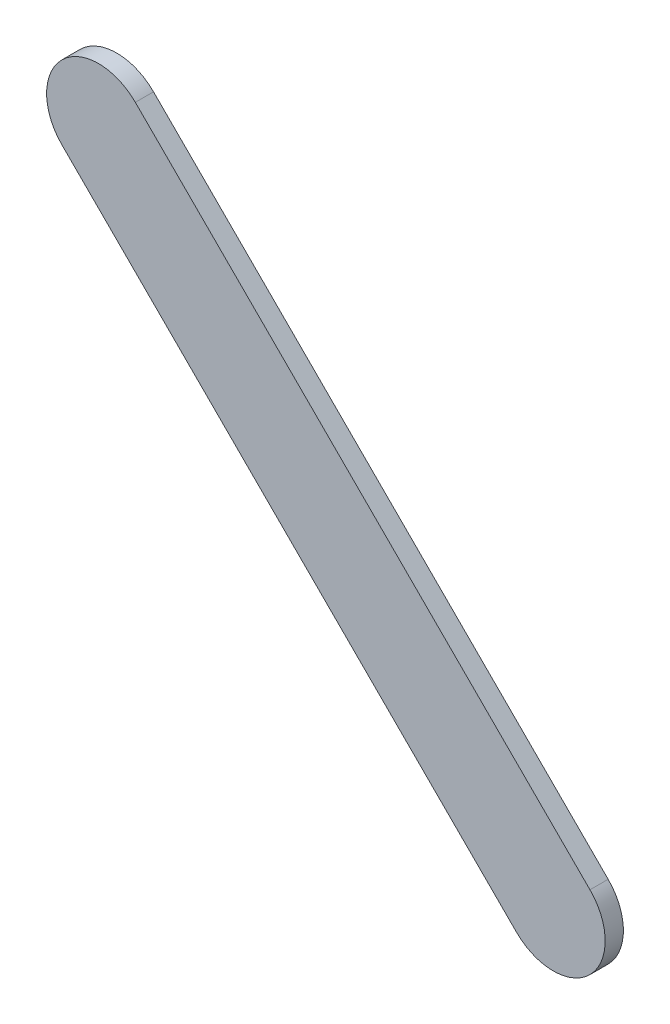
ISO-10303-21;
HEADER;
FILE_DESCRIPTION(('STEP AP214'),'2;1');
FILE_NAME('part.step','',(''),(''),'','','');
FILE_SCHEMA(('AUTOMOTIVE_DESIGN { 1 0 10303 214 1 1 1 1 }'));
ENDSEC;
DATA;
#1=APPLICATION_CONTEXT('core data for automotive mechanical design processes');
#2=APPLICATION_PROTOCOL_DEFINITION('international standard','automotive_design',2000,#1);
#3=PRODUCT_CONTEXT('',#1,'mechanical');
#4=PRODUCT('Part','Part','',(#3));
#5=PRODUCT_RELATED_PRODUCT_CATEGORY('part','',(#4));
#6=PRODUCT_DEFINITION_FORMATION('','',#4);
#7=PRODUCT_DEFINITION_CONTEXT('part definition',#1,'design');
#8=PRODUCT_DEFINITION('design','',#6,#7);
#9=PRODUCT_DEFINITION_SHAPE('','',#8);
#10=(LENGTH_UNIT() NAMED_UNIT(*) SI_UNIT(.MILLI.,.METRE.));
#11=(NAMED_UNIT(*) PLANE_ANGLE_UNIT() SI_UNIT($,.RADIAN.));
#12=(NAMED_UNIT(*) SI_UNIT($,.STERADIAN.) SOLID_ANGLE_UNIT());
#13=UNCERTAINTY_MEASURE_WITH_UNIT(LENGTH_MEASURE(1.E-05),#10,'distance_accuracy_value','');
#14=(GEOMETRIC_REPRESENTATION_CONTEXT(3) GLOBAL_UNCERTAINTY_ASSIGNED_CONTEXT((#13)) GLOBAL_UNIT_ASSIGNED_CONTEXT((#10,
#11,#12)) REPRESENTATION_CONTEXT('',''));
#15=CARTESIAN_POINT('',(0.,0.,0.));
#16=DIRECTION('',(0.,0.,1.));
#17=DIRECTION('',(1.,0.,0.));
#18=AXIS2_PLACEMENT_3D('',#15,#16,#17);
#19=CARTESIAN_POINT('',(86.760096,-111.704289,1.635));
#20=DIRECTION('',(0.,0.,1.));
#21=DIRECTION('',(1.,0.,0.));
#22=AXIS2_PLACEMENT_3D('',#19,#20,#21);
#23=PLANE('',#22);
#24=DIRECTION('',(-0.707106781186548,0.707106781186548,0.));
#25=VECTOR('',#24,1.);
#26=CARTESIAN_POINT('',(86.760096,-111.704289,1.635));
#27=LINE('',#26,#25);
#28=CARTESIAN_POINT('',(86.760096,-111.704289,1.635));
#29=VERTEX_POINT('',#28);
#30=CARTESIAN_POINT('',(85.885096,-110.829289,1.635));
#31=VERTEX_POINT('',#30);
#32=EDGE_CURVE('E93',#29,#31,#27,.T.);
#33=ORIENTED_EDGE('',*,*,#32,.T.);
#34=CARTESIAN_POINT('',(85.8143855,-110.8999995,1.635));
#35=DIRECTION('',(0.,0.,1.));
#36=DIRECTION('',(0.707106781186548,0.707106781186548,0.));
#37=AXIS2_PLACEMENT_3D('',#34,#35,#36);
#38=CIRCLE('',#37,0.09999974810219);
#39=CARTESIAN_POINT('',(85.743675,-110.97071,1.635));
#40=VERTEX_POINT('',#39);
#41=EDGE_CURVE('E74',#31,#40,#38,.T.);
#42=ORIENTED_EDGE('',*,*,#41,.T.);
#43=DIRECTION('',(0.707106781186548,-0.707106781186548,0.));
#44=VECTOR('',#43,1.);
#45=CARTESIAN_POINT('',(85.743675,-110.97071,1.635));
#46=LINE('',#45,#44);
#47=CARTESIAN_POINT('',(86.618675,-111.84571,1.635));
#48=VERTEX_POINT('',#47);
#49=EDGE_CURVE('E87',#40,#48,#46,.T.);
#50=ORIENTED_EDGE('',*,*,#49,.T.);
#51=CARTESIAN_POINT('',(86.6893855,-111.7749995,1.635));
#52=DIRECTION('',(0.,0.,1.));
#53=DIRECTION('',(-0.707106781187048,-0.707106781186048,0.));
#54=AXIS2_PLACEMENT_3D('',#51,#52,#53);
#55=CIRCLE('',#54,0.09999974810218);
#56=EDGE_CURVE('E11',#48,#29,#55,.T.);
#57=ORIENTED_EDGE('',*,*,#56,.T.);
#58=EDGE_LOOP('',(#33,#42,#50,#57));
#59=FACE_BOUND('',#58,.T.);
#60=ADVANCED_FACE('F17',(#59),#23,.T.);
#61=CARTESIAN_POINT('',(86.760096,-111.704289,1.6));
#62=DIRECTION('',(0.,0.,1.));
#63=DIRECTION('',(1.,0.,0.));
#64=AXIS2_PLACEMENT_3D('',#61,#62,#63);
#65=PLANE('',#64);
#66=CARTESIAN_POINT('',(86.6893855,-111.7749995,1.6));
#67=DIRECTION('',(0.,0.,1.));
#68=DIRECTION('',(-0.707106781187048,-0.707106781186048,0.));
#69=AXIS2_PLACEMENT_3D('',#66,#67,#68);
#70=CIRCLE('',#69,0.09999974810218);
#71=CARTESIAN_POINT('',(86.618675,-111.84571,1.6));
#72=VERTEX_POINT('',#71);
#73=CARTESIAN_POINT('',(86.760096,-111.704289,1.6));
#74=VERTEX_POINT('',#73);
#75=EDGE_CURVE('E21',#72,#74,#70,.T.);
#76=ORIENTED_EDGE('',*,*,#75,.F.);
#77=DIRECTION('',(0.707106781186548,-0.707106781186548,0.));
#78=VECTOR('',#77,1.);
#79=CARTESIAN_POINT('',(85.743675,-110.97071,1.6));
#80=LINE('',#79,#78);
#81=CARTESIAN_POINT('',(85.743675,-110.97071,1.6));
#82=VERTEX_POINT('',#81);
#83=EDGE_CURVE('E58',#82,#72,#80,.T.);
#84=ORIENTED_EDGE('',*,*,#83,.F.);
#85=CARTESIAN_POINT('',(85.8143855,-110.8999995,1.6));
#86=DIRECTION('',(0.,0.,1.));
#87=DIRECTION('',(0.707106781186548,0.707106781186548,0.));
#88=AXIS2_PLACEMENT_3D('',#85,#86,#87);
#89=CIRCLE('',#88,0.09999974810219);
#90=CARTESIAN_POINT('',(85.885096,-110.829289,1.6));
#91=VERTEX_POINT('',#90);
#92=EDGE_CURVE('E95',#91,#82,#89,.T.);
#93=ORIENTED_EDGE('',*,*,#92,.F.);
#94=DIRECTION('',(-0.707106781186548,0.707106781186548,0.));
#95=VECTOR('',#94,1.);
#96=CARTESIAN_POINT('',(86.760096,-111.704289,1.6));
#97=LINE('',#96,#95);
#98=EDGE_CURVE('E92',#74,#91,#97,.T.);
#99=ORIENTED_EDGE('',*,*,#98,.F.);
#100=EDGE_LOOP('',(#76,#84,#93,#99));
#101=FACE_BOUND('',#100,.T.);
#102=ADVANCED_FACE('F97',(#101),#65,.F.);
#103=CARTESIAN_POINT('',(86.6893855,-111.7749995,1.6));
#104=DIRECTION('',(0.,0.,-1.));
#105=DIRECTION('',(-0.707106781187048,-0.707106781186048,0.));
#106=AXIS2_PLACEMENT_3D('',#103,#104,#105);
#107=CYLINDRICAL_SURFACE('',#106,0.09999974810218);
#108=ORIENTED_EDGE('',*,*,#75,.T.);
#109=DIRECTION('',(0.,0.,1.));
#110=VECTOR('',#109,1.);
#111=CARTESIAN_POINT('',(86.760096,-111.704289,1.6));
#112=LINE('',#111,#110);
#113=EDGE_CURVE('E82',#74,#29,#112,.T.);
#114=ORIENTED_EDGE('',*,*,#113,.T.);
#115=ORIENTED_EDGE('',*,*,#56,.F.);
#116=DIRECTION('',(0.,0.,1.));
#117=VECTOR('',#116,1.);
#118=CARTESIAN_POINT('',(86.618675,-111.84571,1.6));
#119=LINE('',#118,#117);
#120=EDGE_CURVE('E85',#72,#48,#119,.T.);
#121=ORIENTED_EDGE('',*,*,#120,.F.);
#122=EDGE_LOOP('',(#108,#114,#115,#121));
#123=FACE_BOUND('',#122,.T.);
#124=ADVANCED_FACE('F19',(#123),#107,.T.);
#125=CARTESIAN_POINT('',(85.743675,-110.97071,1.6));
#126=DIRECTION('',(0.707106781186548,0.707106781186548,0.));
#127=DIRECTION('',(0.,0.,-1.));
#128=AXIS2_PLACEMENT_3D('',#125,#126,#127);
#129=PLANE('',#128);
#130=ORIENTED_EDGE('',*,*,#83,.T.);
#131=ORIENTED_EDGE('',*,*,#120,.T.);
#132=ORIENTED_EDGE('',*,*,#49,.F.);
#133=DIRECTION('',(0.,0.,1.));
#134=VECTOR('',#133,1.);
#135=CARTESIAN_POINT('',(85.743675,-110.97071,1.6));
#136=LINE('',#135,#134);
#137=EDGE_CURVE('E112',#82,#40,#136,.T.);
#138=ORIENTED_EDGE('',*,*,#137,.F.);
#139=EDGE_LOOP('',(#130,#131,#132,#138));
#140=FACE_BOUND('',#139,.T.);
#141=ADVANCED_FACE('F124',(#140),#129,.F.);
#142=CARTESIAN_POINT('',(85.8143855,-110.8999995,1.6));
#143=DIRECTION('',(0.,0.,-1.));
#144=DIRECTION('',(0.707106781186548,0.707106781186548,0.));
#145=AXIS2_PLACEMENT_3D('',#142,#143,#144);
#146=CYLINDRICAL_SURFACE('',#145,0.09999974810219);
#147=ORIENTED_EDGE('',*,*,#92,.T.);
#148=ORIENTED_EDGE('',*,*,#137,.T.);
#149=ORIENTED_EDGE('',*,*,#41,.F.);
#150=DIRECTION('',(0.,0.,1.));
#151=VECTOR('',#150,1.);
#152=CARTESIAN_POINT('',(85.885096,-110.829289,1.6));
#153=LINE('',#152,#151);
#154=EDGE_CURVE('E100',#91,#31,#153,.T.);
#155=ORIENTED_EDGE('',*,*,#154,.F.);
#156=EDGE_LOOP('',(#147,#148,#149,#155));
#157=FACE_BOUND('',#156,.T.);
#158=ADVANCED_FACE('F125',(#157),#146,.T.);
#159=CARTESIAN_POINT('',(86.760096,-111.704289,1.6));
#160=DIRECTION('',(-0.707106781186548,-0.707106781186548,0.));
#161=DIRECTION('',(-0.707106781186548,0.707106781186548,0.));
#162=AXIS2_PLACEMENT_3D('',#159,#160,#161);
#163=PLANE('',#162);
#164=ORIENTED_EDGE('',*,*,#98,.T.);
#165=ORIENTED_EDGE('',*,*,#154,.T.);
#166=ORIENTED_EDGE('',*,*,#32,.F.);
#167=ORIENTED_EDGE('',*,*,#113,.F.);
#168=EDGE_LOOP('',(#164,#165,#166,#167));
#169=FACE_BOUND('',#168,.T.);
#170=ADVANCED_FACE('F90',(#169),#163,.F.);
#171=CLOSED_SHELL('',(#60,#102,#124,#141,#158,#170));
#172=MANIFOLD_SOLID_BREP('B1',#171);
#173=ADVANCED_BREP_SHAPE_REPRESENTATION('',(#18,#172),#14);
#174=SHAPE_DEFINITION_REPRESENTATION(#9,#173);
ENDSEC;
END-ISO-10303-21;
